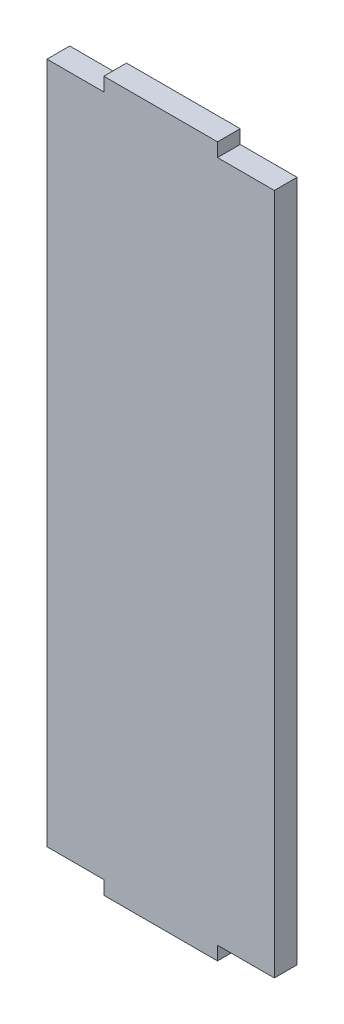
ISO-10303-21;
HEADER;
FILE_DESCRIPTION(('STEP AP214'),'2;1');
FILE_NAME('part.step','',(''),(''),'','','');
FILE_SCHEMA(('AUTOMOTIVE_DESIGN { 1 0 10303 214 1 1 1 1 }'));
ENDSEC;
DATA;
#1=APPLICATION_CONTEXT('core data for automotive mechanical design processes');
#2=APPLICATION_PROTOCOL_DEFINITION('international standard','automotive_design',2000,#1);
#3=PRODUCT_CONTEXT('',#1,'mechanical');
#4=PRODUCT('Part','Part','',(#3));
#5=PRODUCT_RELATED_PRODUCT_CATEGORY('part','',(#4));
#6=PRODUCT_DEFINITION_FORMATION('','',#4);
#7=PRODUCT_DEFINITION_CONTEXT('part definition',#1,'design');
#8=PRODUCT_DEFINITION('design','',#6,#7);
#9=PRODUCT_DEFINITION_SHAPE('','',#8);
#10=(LENGTH_UNIT() NAMED_UNIT(*) SI_UNIT(.MILLI.,.METRE.));
#11=(NAMED_UNIT(*) PLANE_ANGLE_UNIT() SI_UNIT($,.RADIAN.));
#12=(NAMED_UNIT(*) SI_UNIT($,.STERADIAN.) SOLID_ANGLE_UNIT());
#13=UNCERTAINTY_MEASURE_WITH_UNIT(LENGTH_MEASURE(1.E-05),#10,'distance_accuracy_value','');
#14=(GEOMETRIC_REPRESENTATION_CONTEXT(3) GLOBAL_UNCERTAINTY_ASSIGNED_CONTEXT((#13)) GLOBAL_UNIT_ASSIGNED_CONTEXT((#10,
#11,#12)) REPRESENTATION_CONTEXT('',''));
#15=CARTESIAN_POINT('',(0.,0.,0.));
#16=DIRECTION('',(0.,0.,1.));
#17=DIRECTION('',(1.,0.,0.));
#18=AXIS2_PLACEMENT_3D('',#15,#16,#17);
#19=CARTESIAN_POINT('',(-25.,-75.,5.));
#20=DIRECTION('',(0.,1.,0.));
#21=DIRECTION('',(0.,0.,1.));
#22=AXIS2_PLACEMENT_3D('',#19,#20,#21);
#23=PLANE('',#22);
#24=DIRECTION('',(1.,0.,0.));
#25=VECTOR('',#24,1.);
#26=CARTESIAN_POINT('',(-25.,-75.,5.));
#27=LINE('',#26,#25);
#28=CARTESIAN_POINT('',(12.5,-75.,5.));
#29=VERTEX_POINT('',#28);
#30=CARTESIAN_POINT('',(25.,-75.,5.));
#31=VERTEX_POINT('',#30);
#32=EDGE_CURVE('E192',#29,#31,#27,.T.);
#33=ORIENTED_EDGE('',*,*,#32,.F.);
#34=DIRECTION('',(0.,0.,-1.));
#35=VECTOR('',#34,1.);
#36=CARTESIAN_POINT('',(12.5,-75.,0.));
#37=LINE('',#36,#35);
#38=CARTESIAN_POINT('',(12.5,-75.,0.));
#39=VERTEX_POINT('',#38);
#40=EDGE_CURVE('E129',#29,#39,#37,.T.);
#41=ORIENTED_EDGE('',*,*,#40,.T.);
#42=DIRECTION('',(1.,0.,0.));
#43=VECTOR('',#42,1.);
#44=CARTESIAN_POINT('',(-25.,-75.,0.));
#45=LINE('',#44,#43);
#46=CARTESIAN_POINT('',(25.,-75.,0.));
#47=VERTEX_POINT('',#46);
#48=EDGE_CURVE('E203',#39,#47,#45,.T.);
#49=ORIENTED_EDGE('',*,*,#48,.T.);
#50=DIRECTION('',(0.,0.,-1.));
#51=VECTOR('',#50,1.);
#52=CARTESIAN_POINT('',(25.,-75.,5.));
#53=LINE('',#52,#51);
#54=EDGE_CURVE('E195',#31,#47,#53,.T.);
#55=ORIENTED_EDGE('',*,*,#54,.F.);
#56=EDGE_LOOP('',(#33,#41,#49,#55));
#57=FACE_BOUND('',#56,.T.);
#58=ADVANCED_FACE('F33',(#57),#23,.F.);
#59=CARTESIAN_POINT('',(-25.,75.,5.));
#60=DIRECTION('',(0.,-1.,0.));
#61=DIRECTION('',(0.,0.,-1.));
#62=AXIS2_PLACEMENT_3D('',#59,#60,#61);
#63=PLANE('',#62);
#64=DIRECTION('',(0.,0.,-1.));
#65=VECTOR('',#64,1.);
#66=CARTESIAN_POINT('',(12.5,75.,0.));
#67=LINE('',#66,#65);
#68=CARTESIAN_POINT('',(12.5,75.,5.));
#69=VERTEX_POINT('',#68);
#70=CARTESIAN_POINT('',(12.5,75.,0.));
#71=VERTEX_POINT('',#70);
#72=EDGE_CURVE('E56',#69,#71,#67,.T.);
#73=ORIENTED_EDGE('',*,*,#72,.F.);
#74=DIRECTION('',(-1.,0.,0.));
#75=VECTOR('',#74,1.);
#76=CARTESIAN_POINT('',(-25.,75.,5.));
#77=LINE('',#76,#75);
#78=CARTESIAN_POINT('',(25.,75.,5.));
#79=VERTEX_POINT('',#78);
#80=EDGE_CURVE('E188',#79,#69,#77,.T.);
#81=ORIENTED_EDGE('',*,*,#80,.F.);
#82=DIRECTION('',(0.,0.,-1.));
#83=VECTOR('',#82,1.);
#84=CARTESIAN_POINT('',(25.,75.,5.));
#85=LINE('',#84,#83);
#86=CARTESIAN_POINT('',(25.,75.,0.));
#87=VERTEX_POINT('',#86);
#88=EDGE_CURVE('E11',#79,#87,#85,.T.);
#89=ORIENTED_EDGE('',*,*,#88,.T.);
#90=DIRECTION('',(-1.,0.,0.));
#91=VECTOR('',#90,1.);
#92=CARTESIAN_POINT('',(-25.,75.,0.));
#93=LINE('',#92,#91);
#94=EDGE_CURVE('E199',#87,#71,#93,.T.);
#95=ORIENTED_EDGE('',*,*,#94,.T.);
#96=EDGE_LOOP('',(#73,#81,#89,#95));
#97=FACE_BOUND('',#96,.T.);
#98=ADVANCED_FACE('F242',(#97),#63,.F.);
#99=DIRECTION('',(0.,0.,1.));
#100=VECTOR('',#99,1.);
#101=CARTESIAN_POINT('',(-12.5,75.,0.));
#102=LINE('',#101,#100);
#103=CARTESIAN_POINT('',(-12.5,75.,0.));
#104=VERTEX_POINT('',#103);
#105=CARTESIAN_POINT('',(-12.5,75.,5.));
#106=VERTEX_POINT('',#105);
#107=EDGE_CURVE('E162',#104,#106,#102,.T.);
#108=ORIENTED_EDGE('',*,*,#107,.F.);
#109=CARTESIAN_POINT('',(-25.,75.,0.));
#110=VERTEX_POINT('',#109);
#111=EDGE_CURVE('E198',#104,#110,#93,.T.);
#112=ORIENTED_EDGE('',*,*,#111,.T.);
#113=DIRECTION('',(0.,0.,-1.));
#114=VECTOR('',#113,1.);
#115=CARTESIAN_POINT('',(-25.,75.,5.));
#116=LINE('',#115,#114);
#117=CARTESIAN_POINT('',(-25.,75.,5.));
#118=VERTEX_POINT('',#117);
#119=EDGE_CURVE('E41',#118,#110,#116,.T.);
#120=ORIENTED_EDGE('',*,*,#119,.F.);
#121=EDGE_CURVE('E186',#106,#118,#77,.T.);
#122=ORIENTED_EDGE('',*,*,#121,.F.);
#123=EDGE_LOOP('',(#108,#112,#120,#122));
#124=FACE_BOUND('',#123,.T.);
#125=ADVANCED_FACE('F229',(#124),#63,.F.);
#126=CARTESIAN_POINT('',(25.,75.,5.));
#127=DIRECTION('',(-1.,0.,0.));
#128=DIRECTION('',(0.,-1.,0.));
#129=AXIS2_PLACEMENT_3D('',#126,#127,#128);
#130=PLANE('',#129);
#131=DIRECTION('',(0.,1.,0.));
#132=VECTOR('',#131,1.);
#133=CARTESIAN_POINT('',(25.,75.,0.));
#134=LINE('',#133,#132);
#135=EDGE_CURVE('E183',#47,#87,#134,.T.);
#136=ORIENTED_EDGE('',*,*,#135,.T.);
#137=ORIENTED_EDGE('',*,*,#88,.F.);
#138=DIRECTION('',(0.,1.,0.));
#139=VECTOR('',#138,1.);
#140=CARTESIAN_POINT('',(25.,75.,5.));
#141=LINE('',#140,#139);
#142=EDGE_CURVE('E184',#31,#79,#141,.T.);
#143=ORIENTED_EDGE('',*,*,#142,.F.);
#144=ORIENTED_EDGE('',*,*,#54,.T.);
#145=EDGE_LOOP('',(#136,#137,#143,#144));
#146=FACE_BOUND('',#145,.T.);
#147=ADVANCED_FACE('F35',(#146),#130,.F.);
#148=CARTESIAN_POINT('',(-25.,75.,5.));
#149=DIRECTION('',(1.,0.,0.));
#150=DIRECTION('',(0.,1.,0.));
#151=AXIS2_PLACEMENT_3D('',#148,#149,#150);
#152=PLANE('',#151);
#153=DIRECTION('',(0.,-1.,0.));
#154=VECTOR('',#153,1.);
#155=CARTESIAN_POINT('',(-25.,75.,0.));
#156=LINE('',#155,#154);
#157=CARTESIAN_POINT('',(-25.,-75.,0.));
#158=VERTEX_POINT('',#157);
#159=EDGE_CURVE('E201',#110,#158,#156,.T.);
#160=ORIENTED_EDGE('',*,*,#159,.T.);
#161=DIRECTION('',(0.,0.,-1.));
#162=VECTOR('',#161,1.);
#163=CARTESIAN_POINT('',(-25.,-75.,5.));
#164=LINE('',#163,#162);
#165=CARTESIAN_POINT('',(-25.,-75.,5.));
#166=VERTEX_POINT('',#165);
#167=EDGE_CURVE('E208',#166,#158,#164,.T.);
#168=ORIENTED_EDGE('',*,*,#167,.F.);
#169=DIRECTION('',(0.,-1.,0.));
#170=VECTOR('',#169,1.);
#171=CARTESIAN_POINT('',(-25.,75.,5.));
#172=LINE('',#171,#170);
#173=EDGE_CURVE('E190',#118,#166,#172,.T.);
#174=ORIENTED_EDGE('',*,*,#173,.F.);
#175=ORIENTED_EDGE('',*,*,#119,.T.);
#176=EDGE_LOOP('',(#160,#168,#174,#175));
#177=FACE_BOUND('',#176,.T.);
#178=ADVANCED_FACE('F215',(#177),#152,.F.);
#179=CARTESIAN_POINT('',(-12.5,-75.,0.));
#180=VERTEX_POINT('',#179);
#181=EDGE_CURVE('E187',#158,#180,#45,.T.);
#182=ORIENTED_EDGE('',*,*,#181,.T.);
#183=DIRECTION('',(0.,0.,1.));
#184=VECTOR('',#183,1.);
#185=CARTESIAN_POINT('',(-12.5,-75.,0.));
#186=LINE('',#185,#184);
#187=CARTESIAN_POINT('',(-12.5,-75.,5.));
#188=VERTEX_POINT('',#187);
#189=EDGE_CURVE('E141',#180,#188,#186,.T.);
#190=ORIENTED_EDGE('',*,*,#189,.T.);
#191=EDGE_CURVE('E193',#166,#188,#27,.T.);
#192=ORIENTED_EDGE('',*,*,#191,.F.);
#193=ORIENTED_EDGE('',*,*,#167,.T.);
#194=EDGE_LOOP('',(#182,#190,#192,#193));
#195=FACE_BOUND('',#194,.T.);
#196=ADVANCED_FACE('F225',(#195),#23,.F.);
#197=CARTESIAN_POINT('',(0.,0.,5.));
#198=DIRECTION('',(0.,0.,1.));
#199=DIRECTION('',(1.,0.,0.));
#200=AXIS2_PLACEMENT_3D('',#197,#198,#199);
#201=PLANE('',#200);
#202=ORIENTED_EDGE('',*,*,#142,.T.);
#203=ORIENTED_EDGE('',*,*,#80,.T.);
#204=DIRECTION('',(0.,-1.,0.));
#205=VECTOR('',#204,1.);
#206=CARTESIAN_POINT('',(12.5,78.,5.));
#207=LINE('',#206,#205);
#208=CARTESIAN_POINT('',(12.5,78.,5.));
#209=VERTEX_POINT('',#208);
#210=EDGE_CURVE('E168',#209,#69,#207,.T.);
#211=ORIENTED_EDGE('',*,*,#210,.F.);
#212=DIRECTION('',(1.,0.,0.));
#213=VECTOR('',#212,1.);
#214=CARTESIAN_POINT('',(-12.5,78.,5.));
#215=LINE('',#214,#213);
#216=CARTESIAN_POINT('',(-12.5,78.,5.));
#217=VERTEX_POINT('',#216);
#218=EDGE_CURVE('E166',#217,#209,#215,.T.);
#219=ORIENTED_EDGE('',*,*,#218,.F.);
#220=DIRECTION('',(0.,-1.,0.));
#221=VECTOR('',#220,1.);
#222=CARTESIAN_POINT('',(-12.5,78.,5.));
#223=LINE('',#222,#221);
#224=EDGE_CURVE('E174',#217,#106,#223,.T.);
#225=ORIENTED_EDGE('',*,*,#224,.T.);
#226=ORIENTED_EDGE('',*,*,#121,.T.);
#227=ORIENTED_EDGE('',*,*,#173,.T.);
#228=ORIENTED_EDGE('',*,*,#191,.T.);
#229=DIRECTION('',(0.,1.,0.));
#230=VECTOR('',#229,1.);
#231=CARTESIAN_POINT('',(-12.5,-78.,5.));
#232=LINE('',#231,#230);
#233=CARTESIAN_POINT('',(-12.5,-78.,5.));
#234=VERTEX_POINT('',#233);
#235=EDGE_CURVE('E48',#234,#188,#232,.T.);
#236=ORIENTED_EDGE('',*,*,#235,.F.);
#237=DIRECTION('',(1.,0.,0.));
#238=VECTOR('',#237,1.);
#239=CARTESIAN_POINT('',(-12.5,-78.,5.));
#240=LINE('',#239,#238);
#241=CARTESIAN_POINT('',(12.5,-78.,5.));
#242=VERTEX_POINT('',#241);
#243=EDGE_CURVE('E138',#234,#242,#240,.T.);
#244=ORIENTED_EDGE('',*,*,#243,.T.);
#245=DIRECTION('',(0.,1.,0.));
#246=VECTOR('',#245,1.);
#247=CARTESIAN_POINT('',(12.5,-78.,5.));
#248=LINE('',#247,#246);
#249=EDGE_CURVE('E123',#242,#29,#248,.T.);
#250=ORIENTED_EDGE('',*,*,#249,.T.);
#251=ORIENTED_EDGE('',*,*,#32,.T.);
#252=EDGE_LOOP('',(#202,#203,#211,#219,#225,#226,#227,#228,#236,#244,#250,#251));
#253=FACE_BOUND('',#252,.T.);
#254=ADVANCED_FACE('F144',(#253),#201,.T.);
#255=CARTESIAN_POINT('',(0.,0.,0.));
#256=DIRECTION('',(0.,0.,1.));
#257=DIRECTION('',(1.,0.,0.));
#258=AXIS2_PLACEMENT_3D('',#255,#256,#257);
#259=PLANE('',#258);
#260=ORIENTED_EDGE('',*,*,#135,.F.);
#261=ORIENTED_EDGE('',*,*,#48,.F.);
#262=DIRECTION('',(0.,1.,0.));
#263=VECTOR('',#262,1.);
#264=CARTESIAN_POINT('',(12.5,-78.,0.));
#265=LINE('',#264,#263);
#266=CARTESIAN_POINT('',(12.5,-78.,0.));
#267=VERTEX_POINT('',#266);
#268=EDGE_CURVE('E151',#267,#39,#265,.T.);
#269=ORIENTED_EDGE('',*,*,#268,.F.);
#270=DIRECTION('',(-1.,0.,0.));
#271=VECTOR('',#270,1.);
#272=CARTESIAN_POINT('',(-12.5,-78.,0.));
#273=LINE('',#272,#271);
#274=CARTESIAN_POINT('',(-12.5,-78.,0.));
#275=VERTEX_POINT('',#274);
#276=EDGE_CURVE('E140',#267,#275,#273,.T.);
#277=ORIENTED_EDGE('',*,*,#276,.T.);
#278=DIRECTION('',(0.,1.,0.));
#279=VECTOR('',#278,1.);
#280=CARTESIAN_POINT('',(-12.5,-78.,0.));
#281=LINE('',#280,#279);
#282=EDGE_CURVE('E155',#275,#180,#281,.T.);
#283=ORIENTED_EDGE('',*,*,#282,.T.);
#284=ORIENTED_EDGE('',*,*,#181,.F.);
#285=ORIENTED_EDGE('',*,*,#159,.F.);
#286=ORIENTED_EDGE('',*,*,#111,.F.);
#287=DIRECTION('',(0.,-1.,0.));
#288=VECTOR('',#287,1.);
#289=CARTESIAN_POINT('',(-12.5,78.,0.));
#290=LINE('',#289,#288);
#291=CARTESIAN_POINT('',(-12.5,78.,0.));
#292=VERTEX_POINT('',#291);
#293=EDGE_CURVE('E177',#292,#104,#290,.T.);
#294=ORIENTED_EDGE('',*,*,#293,.F.);
#295=DIRECTION('',(-1.,0.,0.));
#296=VECTOR('',#295,1.);
#297=CARTESIAN_POINT('',(-12.5,78.,0.));
#298=LINE('',#297,#296);
#299=CARTESIAN_POINT('',(12.5,78.,0.));
#300=VERTEX_POINT('',#299);
#301=EDGE_CURVE('E161',#300,#292,#298,.T.);
#302=ORIENTED_EDGE('',*,*,#301,.F.);
#303=DIRECTION('',(0.,-1.,0.));
#304=VECTOR('',#303,1.);
#305=CARTESIAN_POINT('',(12.5,78.,0.));
#306=LINE('',#305,#304);
#307=EDGE_CURVE('E180',#300,#71,#306,.T.);
#308=ORIENTED_EDGE('',*,*,#307,.T.);
#309=ORIENTED_EDGE('',*,*,#94,.F.);
#310=EDGE_LOOP('',(#260,#261,#269,#277,#283,#284,#285,#286,#294,#302,#308,#309));
#311=FACE_BOUND('',#310,.T.);
#312=ADVANCED_FACE('F222',(#311),#259,.F.);
#313=CARTESIAN_POINT('',(12.5,78.,0.));
#314=DIRECTION('',(-1.,0.,0.));
#315=DIRECTION('',(0.,0.,1.));
#316=AXIS2_PLACEMENT_3D('',#313,#314,#315);
#317=PLANE('',#316);
#318=ORIENTED_EDGE('',*,*,#72,.T.);
#319=ORIENTED_EDGE('',*,*,#307,.F.);
#320=DIRECTION('',(0.,0.,-1.));
#321=VECTOR('',#320,1.);
#322=CARTESIAN_POINT('',(12.5,78.,0.));
#323=LINE('',#322,#321);
#324=EDGE_CURVE('E158',#209,#300,#323,.T.);
#325=ORIENTED_EDGE('',*,*,#324,.F.);
#326=ORIENTED_EDGE('',*,*,#210,.T.);
#327=EDGE_LOOP('',(#318,#319,#325,#326));
#328=FACE_BOUND('',#327,.T.);
#329=ADVANCED_FACE('F239',(#328),#317,.F.);
#330=CARTESIAN_POINT('',(-12.5,78.,0.));
#331=DIRECTION('',(1.,0.,0.));
#332=DIRECTION('',(0.,0.,-1.));
#333=AXIS2_PLACEMENT_3D('',#330,#331,#332);
#334=PLANE('',#333);
#335=ORIENTED_EDGE('',*,*,#107,.T.);
#336=ORIENTED_EDGE('',*,*,#224,.F.);
#337=DIRECTION('',(0.,0.,1.));
#338=VECTOR('',#337,1.);
#339=CARTESIAN_POINT('',(-12.5,78.,0.));
#340=LINE('',#339,#338);
#341=EDGE_CURVE('E164',#292,#217,#340,.T.);
#342=ORIENTED_EDGE('',*,*,#341,.F.);
#343=ORIENTED_EDGE('',*,*,#293,.T.);
#344=EDGE_LOOP('',(#335,#336,#342,#343));
#345=FACE_BOUND('',#344,.T.);
#346=ADVANCED_FACE('F231',(#345),#334,.F.);
#347=CARTESIAN_POINT('',(0.,78.,0.));
#348=DIRECTION('',(0.,1.,0.));
#349=DIRECTION('',(0.,0.,1.));
#350=AXIS2_PLACEMENT_3D('',#347,#348,#349);
#351=PLANE('',#350);
#352=ORIENTED_EDGE('',*,*,#324,.T.);
#353=ORIENTED_EDGE('',*,*,#301,.T.);
#354=ORIENTED_EDGE('',*,*,#341,.T.);
#355=ORIENTED_EDGE('',*,*,#218,.T.);
#356=EDGE_LOOP('',(#352,#353,#354,#355));
#357=FACE_BOUND('',#356,.T.);
#358=ADVANCED_FACE('F236',(#357),#351,.T.);
#359=CARTESIAN_POINT('',(12.5,-78.,0.));
#360=DIRECTION('',(1.,0.,0.));
#361=DIRECTION('',(0.,0.,-1.));
#362=AXIS2_PLACEMENT_3D('',#359,#360,#361);
#363=PLANE('',#362);
#364=ORIENTED_EDGE('',*,*,#40,.F.);
#365=ORIENTED_EDGE('',*,*,#249,.F.);
#366=DIRECTION('',(0.,0.,-1.));
#367=VECTOR('',#366,1.);
#368=CARTESIAN_POINT('',(12.5,-78.,0.));
#369=LINE('',#368,#367);
#370=EDGE_CURVE('E126',#242,#267,#369,.T.);
#371=ORIENTED_EDGE('',*,*,#370,.T.);
#372=ORIENTED_EDGE('',*,*,#268,.T.);
#373=EDGE_LOOP('',(#364,#365,#371,#372));
#374=FACE_BOUND('',#373,.T.);
#375=ADVANCED_FACE('F125',(#374),#363,.T.);
#376=CARTESIAN_POINT('',(-12.5,-78.,0.));
#377=DIRECTION('',(-1.,0.,0.));
#378=DIRECTION('',(0.,0.,1.));
#379=AXIS2_PLACEMENT_3D('',#376,#377,#378);
#380=PLANE('',#379);
#381=ORIENTED_EDGE('',*,*,#189,.F.);
#382=ORIENTED_EDGE('',*,*,#282,.F.);
#383=DIRECTION('',(0.,0.,1.));
#384=VECTOR('',#383,1.);
#385=CARTESIAN_POINT('',(-12.5,-78.,0.));
#386=LINE('',#385,#384);
#387=EDGE_CURVE('E146',#275,#234,#386,.T.);
#388=ORIENTED_EDGE('',*,*,#387,.T.);
#389=ORIENTED_EDGE('',*,*,#235,.T.);
#390=EDGE_LOOP('',(#381,#382,#388,#389));
#391=FACE_BOUND('',#390,.T.);
#392=ADVANCED_FACE('F345',(#391),#380,.T.);
#393=CARTESIAN_POINT('',(0.,-78.,0.));
#394=DIRECTION('',(0.,-1.,0.));
#395=DIRECTION('',(0.,0.,1.));
#396=AXIS2_PLACEMENT_3D('',#393,#394,#395);
#397=PLANE('',#396);
#398=ORIENTED_EDGE('',*,*,#370,.F.);
#399=ORIENTED_EDGE('',*,*,#243,.F.);
#400=ORIENTED_EDGE('',*,*,#387,.F.);
#401=ORIENTED_EDGE('',*,*,#276,.F.);
#402=EDGE_LOOP('',(#398,#399,#400,#401));
#403=FACE_BOUND('',#402,.T.);
#404=ADVANCED_FACE('F136',(#403),#397,.T.);
#405=CLOSED_SHELL('',(#58,#98,#125,#147,#178,#196,#254,#312,#329,#346,#358,#375,#392,#404));
#406=MANIFOLD_SOLID_BREP('B2',#405);
#407=ADVANCED_BREP_SHAPE_REPRESENTATION('',(#18,#406),#14);
#408=SHAPE_DEFINITION_REPRESENTATION(#9,#407);
ENDSEC;
END-ISO-10303-21;
